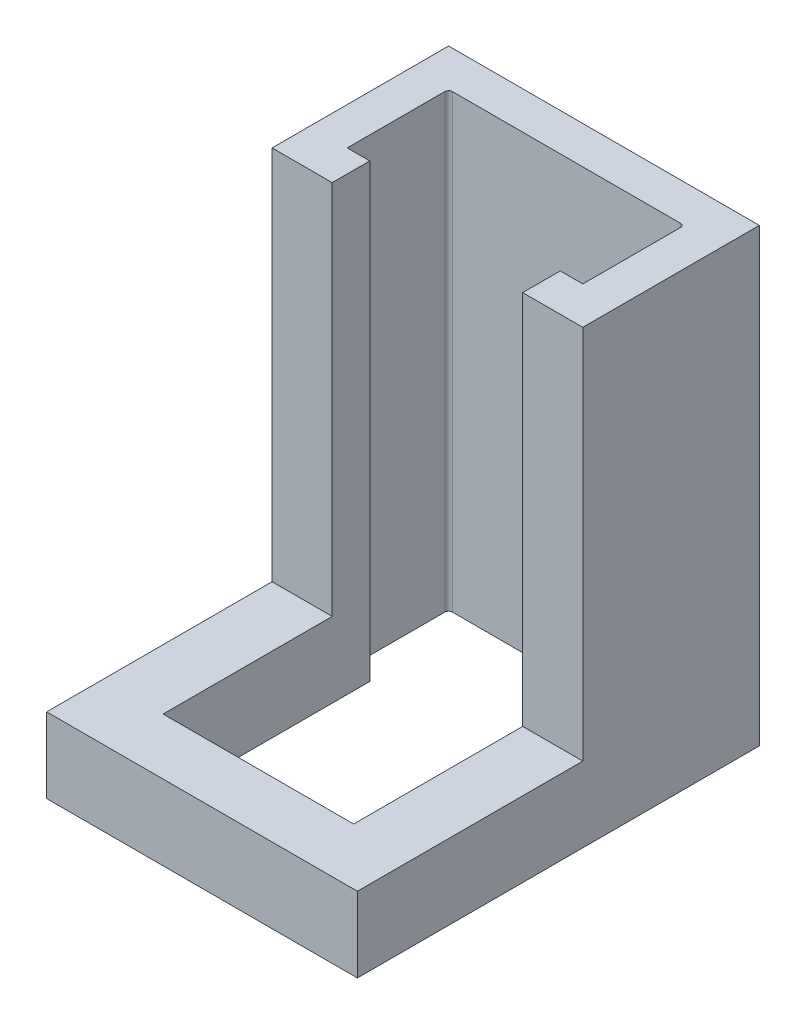
ISO-10303-21;
HEADER;
FILE_DESCRIPTION(('STEP AP214'),'2;1');
FILE_NAME('part.step','',(''),(''),'','','');
FILE_SCHEMA(('AUTOMOTIVE_DESIGN { 1 0 10303 214 1 1 1 1 }'));
ENDSEC;
DATA;
#1=APPLICATION_CONTEXT('core data for automotive mechanical design processes');
#2=APPLICATION_PROTOCOL_DEFINITION('international standard','automotive_design',2000,#1);
#3=PRODUCT_CONTEXT('',#1,'mechanical');
#4=PRODUCT('Part','Part','',(#3));
#5=PRODUCT_RELATED_PRODUCT_CATEGORY('part','',(#4));
#6=PRODUCT_DEFINITION_FORMATION('','',#4);
#7=PRODUCT_DEFINITION_CONTEXT('part definition',#1,'design');
#8=PRODUCT_DEFINITION('design','',#6,#7);
#9=PRODUCT_DEFINITION_SHAPE('','',#8);
#10=(LENGTH_UNIT() NAMED_UNIT(*) SI_UNIT(.MILLI.,.METRE.));
#11=(NAMED_UNIT(*) PLANE_ANGLE_UNIT() SI_UNIT($,.RADIAN.));
#12=(NAMED_UNIT(*) SI_UNIT($,.STERADIAN.) SOLID_ANGLE_UNIT());
#13=UNCERTAINTY_MEASURE_WITH_UNIT(LENGTH_MEASURE(1.E-05),#10,'distance_accuracy_value','');
#14=(GEOMETRIC_REPRESENTATION_CONTEXT(3) GLOBAL_UNCERTAINTY_ASSIGNED_CONTEXT((#13)) GLOBAL_UNIT_ASSIGNED_CONTEXT((#10,
#11,#12)) REPRESENTATION_CONTEXT('',''));
#15=CARTESIAN_POINT('',(0.,0.,0.));
#16=DIRECTION('',(0.,0.,1.));
#17=DIRECTION('',(1.,0.,0.));
#18=AXIS2_PLACEMENT_3D('',#15,#16,#17);
#19=CARTESIAN_POINT('',(15.6765625,50.,0.));
#20=DIRECTION('',(0.,0.,1.));
#21=DIRECTION('',(1.,0.,0.));
#22=AXIS2_PLACEMENT_3D('',#19,#20,#21);
#23=PLANE('',#22);
#24=DIRECTION('',(0.,-1.,0.));
#25=VECTOR('',#24,1.);
#26=CARTESIAN_POINT('',(15.6765625,50.,0.));
#27=LINE('',#26,#25);
#28=CARTESIAN_POINT('',(15.6765625,50.,0.));
#29=VERTEX_POINT('',#28);
#30=CARTESIAN_POINT('',(15.6765625,-10.,0.));
#31=VERTEX_POINT('',#30);
#32=EDGE_CURVE('E313',#29,#31,#27,.T.);
#33=ORIENTED_EDGE('',*,*,#32,.T.);
#34=DIRECTION('',(-1.,0.,0.));
#35=VECTOR('',#34,1.);
#36=CARTESIAN_POINT('',(15.6765625,-10.,0.));
#37=LINE('',#36,#35);
#38=CARTESIAN_POINT('',(12.6765625,-10.,0.));
#39=VERTEX_POINT('',#38);
#40=EDGE_CURVE('E211',#31,#39,#37,.T.);
#41=ORIENTED_EDGE('',*,*,#40,.T.);
#42=DIRECTION('',(0.,-1.,0.));
#43=VECTOR('',#42,1.);
#44=CARTESIAN_POINT('',(12.6765625,50.,0.));
#45=LINE('',#44,#43);
#46=CARTESIAN_POINT('',(12.6765625,50.,0.));
#47=VERTEX_POINT('',#46);
#48=EDGE_CURVE('E11',#47,#39,#45,.T.);
#49=ORIENTED_EDGE('',*,*,#48,.F.);
#50=DIRECTION('',(-1.,0.,0.));
#51=VECTOR('',#50,1.);
#52=CARTESIAN_POINT('',(15.6765625,50.,0.));
#53=LINE('',#52,#51);
#54=EDGE_CURVE('E272',#29,#47,#53,.T.);
#55=ORIENTED_EDGE('',*,*,#54,.F.);
#56=EDGE_LOOP('',(#33,#41,#49,#55));
#57=FACE_BOUND('',#56,.T.);
#58=ADVANCED_FACE('F38',(#57),#23,.F.);
#59=CARTESIAN_POINT('',(12.6765625,50.,0.));
#60=DIRECTION('',(1.,0.,0.));
#61=DIRECTION('',(0.,0.,-1.));
#62=AXIS2_PLACEMENT_3D('',#59,#60,#61);
#63=PLANE('',#62);
#64=ORIENTED_EDGE('',*,*,#48,.T.);
#65=DIRECTION('',(0.,0.,1.));
#66=VECTOR('',#65,1.);
#67=CARTESIAN_POINT('',(12.6765625,-10.,0.));
#68=LINE('',#67,#66);
#69=CARTESIAN_POINT('',(12.6765625,-10.,27.5));
#70=VERTEX_POINT('',#69);
#71=EDGE_CURVE('E215',#39,#70,#68,.T.);
#72=ORIENTED_EDGE('',*,*,#71,.T.);
#73=DIRECTION('',(0.,1.,0.));
#74=VECTOR('',#73,1.);
#75=CARTESIAN_POINT('',(12.6765625,-10.,27.5));
#76=LINE('',#75,#74);
#77=CARTESIAN_POINT('',(12.6765625,0.,27.5));
#78=VERTEX_POINT('',#77);
#79=EDGE_CURVE('E234',#70,#78,#76,.T.);
#80=ORIENTED_EDGE('',*,*,#79,.T.);
#81=DIRECTION('',(0.,0.,1.));
#82=VECTOR('',#81,1.);
#83=CARTESIAN_POINT('',(12.6765625,0.,27.5));
#84=LINE('',#83,#82);
#85=CARTESIAN_POINT('',(12.6765625,0.,5.00000000000001));
#86=VERTEX_POINT('',#85);
#87=EDGE_CURVE('E225',#86,#78,#84,.T.);
#88=ORIENTED_EDGE('',*,*,#87,.F.);
#89=DIRECTION('',(0.,-1.,0.));
#90=VECTOR('',#89,1.);
#91=CARTESIAN_POINT('',(12.6765625,50.,5.));
#92=LINE('',#91,#90);
#93=CARTESIAN_POINT('',(12.6765625,50.,5.));
#94=VERTEX_POINT('',#93);
#95=EDGE_CURVE('E47',#94,#86,#92,.T.);
#96=ORIENTED_EDGE('',*,*,#95,.F.);
#97=DIRECTION('',(0.,0.,1.));
#98=VECTOR('',#97,1.);
#99=CARTESIAN_POINT('',(12.6765625,50.,0.));
#100=LINE('',#99,#98);
#101=EDGE_CURVE('E275',#47,#94,#100,.T.);
#102=ORIENTED_EDGE('',*,*,#101,.F.);
#103=EDGE_LOOP('',(#64,#72,#80,#88,#96,#102));
#104=FACE_BOUND('',#103,.T.);
#105=ADVANCED_FACE('F360',(#104),#63,.F.);
#106=CARTESIAN_POINT('',(12.6765625,50.,5.));
#107=DIRECTION('',(0.,0.,-1.));
#108=DIRECTION('',(-1.,0.,0.));
#109=AXIS2_PLACEMENT_3D('',#106,#107,#108);
#110=PLANE('',#109);
#111=DIRECTION('',(1.,0.,0.));
#112=VECTOR('',#111,1.);
#113=CARTESIAN_POINT('',(12.6765625,0.,5.));
#114=LINE('',#113,#112);
#115=CARTESIAN_POINT('',(20.6765625,0.,5.));
#116=VERTEX_POINT('',#115);
#117=EDGE_CURVE('E271',#86,#116,#114,.T.);
#118=ORIENTED_EDGE('',*,*,#117,.T.);
#119=DIRECTION('',(0.,-1.,0.));
#120=VECTOR('',#119,1.);
#121=CARTESIAN_POINT('',(20.6765625,50.,5.));
#122=LINE('',#121,#120);
#123=CARTESIAN_POINT('',(20.6765625,50.,5.));
#124=VERTEX_POINT('',#123);
#125=EDGE_CURVE('E348',#124,#116,#122,.T.);
#126=ORIENTED_EDGE('',*,*,#125,.F.);
#127=DIRECTION('',(1.,0.,0.));
#128=VECTOR('',#127,1.);
#129=CARTESIAN_POINT('',(12.6765625,50.,5.));
#130=LINE('',#129,#128);
#131=EDGE_CURVE('E279',#94,#124,#130,.T.);
#132=ORIENTED_EDGE('',*,*,#131,.F.);
#133=ORIENTED_EDGE('',*,*,#95,.T.);
#134=EDGE_LOOP('',(#118,#126,#132,#133));
#135=FACE_BOUND('',#134,.T.);
#136=ADVANCED_FACE('F356',(#135),#110,.F.);
#137=CARTESIAN_POINT('',(20.6765625,50.,-18.49375));
#138=DIRECTION('',(-1.,0.,0.));
#139=DIRECTION('',(0.,0.,1.));
#140=AXIS2_PLACEMENT_3D('',#137,#138,#139);
#141=PLANE('',#140);
#142=ORIENTED_EDGE('',*,*,#125,.T.);
#143=DIRECTION('',(0.,0.,1.));
#144=VECTOR('',#143,1.);
#145=CARTESIAN_POINT('',(20.6765625,0.,5.));
#146=LINE('',#145,#144);
#147=CARTESIAN_POINT('',(20.6765625,0.,35.));
#148=VERTEX_POINT('',#147);
#149=EDGE_CURVE('E238',#116,#148,#146,.T.);
#150=ORIENTED_EDGE('',*,*,#149,.T.);
#151=DIRECTION('',(0.,1.,0.));
#152=VECTOR('',#151,1.);
#153=CARTESIAN_POINT('',(20.6765625,-10.,35.));
#154=LINE('',#153,#152);
#155=CARTESIAN_POINT('',(20.6765625,-10.,35.));
#156=VERTEX_POINT('',#155);
#157=EDGE_CURVE('E267',#156,#148,#154,.T.);
#158=ORIENTED_EDGE('',*,*,#157,.F.);
#159=DIRECTION('',(0.,0.,1.));
#160=VECTOR('',#159,1.);
#161=CARTESIAN_POINT('',(20.6765625,-10.,5.));
#162=LINE('',#161,#160);
#163=CARTESIAN_POINT('',(20.6765625,-10.,-18.49375));
#164=VERTEX_POINT('',#163);
#165=EDGE_CURVE('E243',#164,#156,#162,.T.);
#166=ORIENTED_EDGE('',*,*,#165,.F.);
#167=DIRECTION('',(0.,-1.,0.));
#168=VECTOR('',#167,1.);
#169=CARTESIAN_POINT('',(20.6765625,50.,-18.49375));
#170=LINE('',#169,#168);
#171=CARTESIAN_POINT('',(20.6765625,50.,-18.49375));
#172=VERTEX_POINT('',#171);
#173=EDGE_CURVE('E345',#172,#164,#170,.T.);
#174=ORIENTED_EDGE('',*,*,#173,.F.);
#175=DIRECTION('',(0.,0.,-1.));
#176=VECTOR('',#175,1.);
#177=CARTESIAN_POINT('',(20.6765625,50.,5.));
#178=LINE('',#177,#176);
#179=EDGE_CURVE('E282',#124,#172,#178,.T.);
#180=ORIENTED_EDGE('',*,*,#179,.F.);
#181=EDGE_LOOP('',(#142,#150,#158,#166,#174,#180));
#182=FACE_BOUND('',#181,.T.);
#183=ADVANCED_FACE('F368',(#182),#141,.F.);
#184=CARTESIAN_POINT('',(-20.6765625,50.,-18.49375));
#185=DIRECTION('',(0.,0.,1.));
#186=DIRECTION('',(1.,0.,0.));
#187=AXIS2_PLACEMENT_3D('',#184,#185,#186);
#188=PLANE('',#187);
#189=CARTESIAN_POINT('',(0.,10.,-18.49375));
#190=DIRECTION('',(0.,0.,-1.));
#191=DIRECTION('',(-1.,0.,0.));
#192=AXIS2_PLACEMENT_3D('',#189,#190,#191);
#193=CIRCLE('',#192,1.5);
#194=CARTESIAN_POINT('',(-1.5,10.,-18.49375));
#195=VERTEX_POINT('',#194);
#196=EDGE_CURVE('E659',#195,#195,#193,.T.);
#197=ORIENTED_EDGE('',*,*,#196,.F.);
#198=EDGE_LOOP('',(#197));
#199=FACE_BOUND('',#198,.T.);
#200=CARTESIAN_POINT('',(0.,20.,-18.49375));
#201=DIRECTION('',(0.,0.,-1.));
#202=DIRECTION('',(-1.,0.,0.));
#203=AXIS2_PLACEMENT_3D('',#200,#201,#202);
#204=CIRCLE('',#203,1.5);
#205=CARTESIAN_POINT('',(-1.49999999999997,20.,-18.49375));
#206=VERTEX_POINT('',#205);
#207=EDGE_CURVE('E668',#206,#206,#204,.T.);
#208=ORIENTED_EDGE('',*,*,#207,.F.);
#209=EDGE_LOOP('',(#208));
#210=FACE_BOUND('',#209,.T.);
#211=CARTESIAN_POINT('',(0.,30.,-18.49375));
#212=DIRECTION('',(0.,0.,-1.));
#213=DIRECTION('',(-1.,0.,0.));
#214=AXIS2_PLACEMENT_3D('',#211,#212,#213);
#215=CIRCLE('',#214,1.5);
#216=CARTESIAN_POINT('',(-1.49999999999993,30.,-18.49375));
#217=VERTEX_POINT('',#216);
#218=EDGE_CURVE('E676',#217,#217,#215,.T.);
#219=ORIENTED_EDGE('',*,*,#218,.F.);
#220=EDGE_LOOP('',(#219));
#221=FACE_BOUND('',#220,.T.);
#222=ORIENTED_EDGE('',*,*,#173,.T.);
#223=DIRECTION('',(1.,0.,0.));
#224=VECTOR('',#223,1.);
#225=CARTESIAN_POINT('',(20.6765625,-10.,-18.49375));
#226=LINE('',#225,#224);
#227=CARTESIAN_POINT('',(-20.6765625,-10.,-18.49375));
#228=VERTEX_POINT('',#227);
#229=EDGE_CURVE('E239',#228,#164,#226,.T.);
#230=ORIENTED_EDGE('',*,*,#229,.F.);
#231=DIRECTION('',(0.,-1.,0.));
#232=VECTOR('',#231,1.);
#233=CARTESIAN_POINT('',(-20.6765625,50.,-18.49375));
#234=LINE('',#233,#232);
#235=CARTESIAN_POINT('',(-20.6765625,50.,-18.49375));
#236=VERTEX_POINT('',#235);
#237=EDGE_CURVE('E342',#236,#228,#234,.T.);
#238=ORIENTED_EDGE('',*,*,#237,.F.);
#239=DIRECTION('',(-1.,0.,0.));
#240=VECTOR('',#239,1.);
#241=CARTESIAN_POINT('',(-20.6765625,50.,-18.49375));
#242=LINE('',#241,#240);
#243=EDGE_CURVE('E285',#172,#236,#242,.T.);
#244=ORIENTED_EDGE('',*,*,#243,.F.);
#245=EDGE_LOOP('',(#222,#230,#238,#244));
#246=FACE_BOUND('',#245,.T.);
#247=ADVANCED_FACE('F382',(#199,#210,#221,#246),#188,.F.);
#248=CARTESIAN_POINT('',(-20.6765625,50.,5.));
#249=DIRECTION('',(1.,0.,0.));
#250=DIRECTION('',(0.,0.,-1.));
#251=AXIS2_PLACEMENT_3D('',#248,#249,#250);
#252=PLANE('',#251);
#253=ORIENTED_EDGE('',*,*,#237,.T.);
#254=DIRECTION('',(0.,0.,-1.));
#255=VECTOR('',#254,1.);
#256=CARTESIAN_POINT('',(-20.6765625,-10.,35.));
#257=LINE('',#256,#255);
#258=CARTESIAN_POINT('',(-20.6765625,-10.,35.));
#259=VERTEX_POINT('',#258);
#260=EDGE_CURVE('E250',#259,#228,#257,.T.);
#261=ORIENTED_EDGE('',*,*,#260,.F.);
#262=DIRECTION('',(0.,1.,0.));
#263=VECTOR('',#262,1.);
#264=CARTESIAN_POINT('',(-20.6765625,-10.,35.));
#265=LINE('',#264,#263);
#266=CARTESIAN_POINT('',(-20.6765625,0.,35.));
#267=VERTEX_POINT('',#266);
#268=EDGE_CURVE('E254',#259,#267,#265,.T.);
#269=ORIENTED_EDGE('',*,*,#268,.T.);
#270=DIRECTION('',(0.,0.,-1.));
#271=VECTOR('',#270,1.);
#272=CARTESIAN_POINT('',(-20.6765625,0.,-18.49375));
#273=LINE('',#272,#271);
#274=CARTESIAN_POINT('',(-20.6765625,0.,5.));
#275=VERTEX_POINT('',#274);
#276=EDGE_CURVE('E244',#267,#275,#273,.T.);
#277=ORIENTED_EDGE('',*,*,#276,.T.);
#278=DIRECTION('',(0.,-1.,0.));
#279=VECTOR('',#278,1.);
#280=CARTESIAN_POINT('',(-20.6765625,50.,5.));
#281=LINE('',#280,#279);
#282=CARTESIAN_POINT('',(-20.6765625,50.,5.));
#283=VERTEX_POINT('',#282);
#284=EDGE_CURVE('E338',#283,#275,#281,.T.);
#285=ORIENTED_EDGE('',*,*,#284,.F.);
#286=DIRECTION('',(0.,0.,1.));
#287=VECTOR('',#286,1.);
#288=CARTESIAN_POINT('',(-20.6765625,50.,-18.49375));
#289=LINE('',#288,#287);
#290=EDGE_CURVE('E288',#236,#283,#289,.T.);
#291=ORIENTED_EDGE('',*,*,#290,.F.);
#292=EDGE_LOOP('',(#253,#261,#269,#277,#285,#291));
#293=FACE_BOUND('',#292,.T.);
#294=ADVANCED_FACE('F398',(#293),#252,.F.);
#295=CARTESIAN_POINT('',(-12.6765625,50.,5.));
#296=DIRECTION('',(0.,0.,-1.));
#297=DIRECTION('',(-1.,0.,0.));
#298=AXIS2_PLACEMENT_3D('',#295,#296,#297);
#299=PLANE('',#298);
#300=DIRECTION('',(1.,0.,0.));
#301=VECTOR('',#300,1.);
#302=CARTESIAN_POINT('',(-12.6765625,0.,5.));
#303=LINE('',#302,#301);
#304=CARTESIAN_POINT('',(-12.6765625,0.,5.));
#305=VERTEX_POINT('',#304);
#306=EDGE_CURVE('E276',#275,#305,#303,.T.);
#307=ORIENTED_EDGE('',*,*,#306,.T.);
#308=DIRECTION('',(0.,-1.,0.));
#309=VECTOR('',#308,1.);
#310=CARTESIAN_POINT('',(-12.6765625,50.,5.));
#311=LINE('',#310,#309);
#312=CARTESIAN_POINT('',(-12.6765625,50.,5.));
#313=VERTEX_POINT('',#312);
#314=EDGE_CURVE('E170',#313,#305,#311,.T.);
#315=ORIENTED_EDGE('',*,*,#314,.F.);
#316=DIRECTION('',(1.,0.,0.));
#317=VECTOR('',#316,1.);
#318=CARTESIAN_POINT('',(-12.6765625,50.,5.));
#319=LINE('',#318,#317);
#320=EDGE_CURVE('E291',#283,#313,#319,.T.);
#321=ORIENTED_EDGE('',*,*,#320,.F.);
#322=ORIENTED_EDGE('',*,*,#284,.T.);
#323=EDGE_LOOP('',(#307,#315,#321,#322));
#324=FACE_BOUND('',#323,.T.);
#325=ADVANCED_FACE('F395',(#324),#299,.F.);
#326=CARTESIAN_POINT('',(-12.6765625,50.,0.));
#327=DIRECTION('',(-1.,0.,0.));
#328=DIRECTION('',(0.,0.,1.));
#329=AXIS2_PLACEMENT_3D('',#326,#327,#328);
#330=PLANE('',#329);
#331=ORIENTED_EDGE('',*,*,#314,.T.);
#332=DIRECTION('',(0.,0.,-1.));
#333=VECTOR('',#332,1.);
#334=CARTESIAN_POINT('',(-12.6765625,0.,5.));
#335=LINE('',#334,#333);
#336=CARTESIAN_POINT('',(-12.6765625,0.,27.5));
#337=VERTEX_POINT('',#336);
#338=EDGE_CURVE('E222',#337,#305,#335,.T.);
#339=ORIENTED_EDGE('',*,*,#338,.F.);
#340=DIRECTION('',(0.,1.,0.));
#341=VECTOR('',#340,1.);
#342=CARTESIAN_POINT('',(-12.6765625,-10.,27.5));
#343=LINE('',#342,#341);
#344=CARTESIAN_POINT('',(-12.6765625,-10.,27.5));
#345=VERTEX_POINT('',#344);
#346=EDGE_CURVE('E179',#345,#337,#343,.T.);
#347=ORIENTED_EDGE('',*,*,#346,.F.);
#348=DIRECTION('',(0.,0.,-1.));
#349=VECTOR('',#348,1.);
#350=CARTESIAN_POINT('',(-12.6765625,-10.,5.));
#351=LINE('',#350,#349);
#352=CARTESIAN_POINT('',(-12.6765625,-10.,0.));
#353=VERTEX_POINT('',#352);
#354=EDGE_CURVE('E175',#345,#353,#351,.T.);
#355=ORIENTED_EDGE('',*,*,#354,.T.);
#356=DIRECTION('',(0.,-1.,0.));
#357=VECTOR('',#356,1.);
#358=CARTESIAN_POINT('',(-12.6765625,50.,0.));
#359=LINE('',#358,#357);
#360=CARTESIAN_POINT('',(-12.6765625,50.,0.));
#361=VERTEX_POINT('',#360);
#362=EDGE_CURVE('E159',#361,#353,#359,.T.);
#363=ORIENTED_EDGE('',*,*,#362,.F.);
#364=DIRECTION('',(0.,0.,-1.));
#365=VECTOR('',#364,1.);
#366=CARTESIAN_POINT('',(-12.6765625,50.,0.));
#367=LINE('',#366,#365);
#368=EDGE_CURVE('E294',#313,#361,#367,.T.);
#369=ORIENTED_EDGE('',*,*,#368,.F.);
#370=EDGE_LOOP('',(#331,#339,#347,#355,#363,#369));
#371=FACE_BOUND('',#370,.T.);
#372=ADVANCED_FACE('F177',(#371),#330,.F.);
#373=CARTESIAN_POINT('',(-15.6765625,50.,0.));
#374=DIRECTION('',(0.,0.,1.));
#375=DIRECTION('',(1.,0.,0.));
#376=AXIS2_PLACEMENT_3D('',#373,#374,#375);
#377=PLANE('',#376);
#378=ORIENTED_EDGE('',*,*,#362,.T.);
#379=DIRECTION('',(-1.,0.,0.));
#380=VECTOR('',#379,1.);
#381=CARTESIAN_POINT('',(-12.6765625,-10.,0.));
#382=LINE('',#381,#380);
#383=CARTESIAN_POINT('',(-15.6765625,-10.,0.));
#384=VERTEX_POINT('',#383);
#385=EDGE_CURVE('E164',#353,#384,#382,.T.);
#386=ORIENTED_EDGE('',*,*,#385,.T.);
#387=DIRECTION('',(0.,-1.,0.));
#388=VECTOR('',#387,1.);
#389=CARTESIAN_POINT('',(-15.6765625,50.,0.));
#390=LINE('',#389,#388);
#391=CARTESIAN_POINT('',(-15.6765625,50.,0.));
#392=VERTEX_POINT('',#391);
#393=EDGE_CURVE('E171',#392,#384,#390,.T.);
#394=ORIENTED_EDGE('',*,*,#393,.F.);
#395=DIRECTION('',(-1.,0.,0.));
#396=VECTOR('',#395,1.);
#397=CARTESIAN_POINT('',(-15.6765625,50.,0.));
#398=LINE('',#397,#396);
#399=EDGE_CURVE('E166',#361,#392,#398,.T.);
#400=ORIENTED_EDGE('',*,*,#399,.F.);
#401=EDGE_LOOP('',(#378,#386,#394,#400));
#402=FACE_BOUND('',#401,.T.);
#403=ADVANCED_FACE('F161',(#402),#377,.F.);
#404=CARTESIAN_POINT('',(-15.6765625,50.,0.));
#405=DIRECTION('',(-1.,0.,0.));
#406=DIRECTION('',(0.,0.,1.));
#407=AXIS2_PLACEMENT_3D('',#404,#405,#406);
#408=PLANE('',#407);
#409=ORIENTED_EDGE('',*,*,#393,.T.);
#410=DIRECTION('',(0.,0.,-1.));
#411=VECTOR('',#410,1.);
#412=CARTESIAN_POINT('',(-15.6765625,-10.,0.));
#413=LINE('',#412,#411);
#414=CARTESIAN_POINT('',(-15.6765625,-10.,-12.99375));
#415=VERTEX_POINT('',#414);
#416=EDGE_CURVE('E188',#384,#415,#413,.T.);
#417=ORIENTED_EDGE('',*,*,#416,.T.);
#418=DIRECTION('',(0.,-1.,0.));
#419=VECTOR('',#418,1.);
#420=CARTESIAN_POINT('',(-15.6765625,50.,-12.99375));
#421=LINE('',#420,#419);
#422=CARTESIAN_POINT('',(-15.6765625,50.,-12.99375));
#423=VERTEX_POINT('',#422);
#424=EDGE_CURVE('E331',#423,#415,#421,.T.);
#425=ORIENTED_EDGE('',*,*,#424,.F.);
#426=DIRECTION('',(0.,0.,-1.));
#427=VECTOR('',#426,1.);
#428=CARTESIAN_POINT('',(-15.6765625,50.,0.));
#429=LINE('',#428,#427);
#430=EDGE_CURVE('E299',#392,#423,#429,.T.);
#431=ORIENTED_EDGE('',*,*,#430,.F.);
#432=EDGE_LOOP('',(#409,#417,#425,#431));
#433=FACE_BOUND('',#432,.T.);
#434=ADVANCED_FACE('F498',(#433),#408,.F.);
#435=CARTESIAN_POINT('',(-15.1765625,50.,-12.99375));
#436=DIRECTION('',(0.,-1.,0.));
#437=DIRECTION('',(0.,0.,-1.));
#438=AXIS2_PLACEMENT_3D('',#435,#436,#437);
#439=CYLINDRICAL_SURFACE('',#438,0.5);
#440=ORIENTED_EDGE('',*,*,#424,.T.);
#441=CARTESIAN_POINT('',(-15.1765625,-10.,-12.99375));
#442=DIRECTION('',(0.,-1.,0.));
#443=DIRECTION('',(0.,0.,-1.));
#444=AXIS2_PLACEMENT_3D('',#441,#442,#443);
#445=CIRCLE('',#444,0.5);
#446=CARTESIAN_POINT('',(-15.1765625,-10.,-13.49375));
#447=VERTEX_POINT('',#446);
#448=EDGE_CURVE('E192',#415,#447,#445,.T.);
#449=ORIENTED_EDGE('',*,*,#448,.T.);
#450=DIRECTION('',(0.,-1.,0.));
#451=VECTOR('',#450,1.);
#452=CARTESIAN_POINT('',(-15.1765625,50.,-13.49375));
#453=LINE('',#452,#451);
#454=CARTESIAN_POINT('',(-15.1765625,50.,-13.49375));
#455=VERTEX_POINT('',#454);
#456=EDGE_CURVE('E328',#455,#447,#453,.T.);
#457=ORIENTED_EDGE('',*,*,#456,.F.);
#458=CARTESIAN_POINT('',(-15.1765625,50.,-12.99375));
#459=DIRECTION('',(0.,-1.,0.));
#460=DIRECTION('',(0.,0.,-1.));
#461=AXIS2_PLACEMENT_3D('',#458,#459,#460);
#462=CIRCLE('',#461,0.5);
#463=EDGE_CURVE('E302',#423,#455,#462,.T.);
#464=ORIENTED_EDGE('',*,*,#463,.F.);
#465=EDGE_LOOP('',(#440,#449,#457,#464));
#466=FACE_BOUND('',#465,.T.);
#467=ADVANCED_FACE('F443',(#466),#439,.F.);
#468=CARTESIAN_POINT('',(15.1765625,50.,-13.49375));
#469=DIRECTION('',(0.,0.,-1.));
#470=DIRECTION('',(-1.,0.,0.));
#471=AXIS2_PLACEMENT_3D('',#468,#469,#470);
#472=PLANE('',#471);
#473=CARTESIAN_POINT('',(0.,10.,-13.49375));
#474=DIRECTION('',(0.,0.,-1.));
#475=DIRECTION('',(-1.,0.,0.));
#476=AXIS2_PLACEMENT_3D('',#473,#474,#475);
#477=CIRCLE('',#476,1.5);
#478=CARTESIAN_POINT('',(-1.5,10.,-13.49375));
#479=VERTEX_POINT('',#478);
#480=EDGE_CURVE('E226',#479,#479,#477,.F.);
#481=ORIENTED_EDGE('',*,*,#480,.F.);
#482=EDGE_LOOP('',(#481));
#483=FACE_BOUND('',#482,.T.);
#484=CARTESIAN_POINT('',(0.,20.,-13.49375));
#485=DIRECTION('',(0.,0.,-1.));
#486=DIRECTION('',(-1.,0.,0.));
#487=AXIS2_PLACEMENT_3D('',#484,#485,#486);
#488=CIRCLE('',#487,1.5);
#489=CARTESIAN_POINT('',(-1.49999999999997,20.,-13.49375));
#490=VERTEX_POINT('',#489);
#491=EDGE_CURVE('E665',#490,#490,#488,.F.);
#492=ORIENTED_EDGE('',*,*,#491,.F.);
#493=EDGE_LOOP('',(#492));
#494=FACE_BOUND('',#493,.T.);
#495=CARTESIAN_POINT('',(0.,30.,-13.49375));
#496=DIRECTION('',(0.,0.,-1.));
#497=DIRECTION('',(-1.,0.,0.));
#498=AXIS2_PLACEMENT_3D('',#495,#496,#497);
#499=CIRCLE('',#498,1.5);
#500=CARTESIAN_POINT('',(-1.49999999999993,30.,-13.49375));
#501=VERTEX_POINT('',#500);
#502=EDGE_CURVE('E672',#501,#501,#499,.F.);
#503=ORIENTED_EDGE('',*,*,#502,.F.);
#504=EDGE_LOOP('',(#503));
#505=FACE_BOUND('',#504,.T.);
#506=ORIENTED_EDGE('',*,*,#456,.T.);
#507=DIRECTION('',(1.,0.,0.));
#508=VECTOR('',#507,1.);
#509=CARTESIAN_POINT('',(-15.1765625,-10.,-13.49375));
#510=LINE('',#509,#508);
#511=CARTESIAN_POINT('',(15.1765625,-10.,-13.49375));
#512=VERTEX_POINT('',#511);
#513=EDGE_CURVE('E199',#447,#512,#510,.T.);
#514=ORIENTED_EDGE('',*,*,#513,.T.);
#515=DIRECTION('',(0.,-1.,0.));
#516=VECTOR('',#515,1.);
#517=CARTESIAN_POINT('',(15.1765625,50.,-13.49375));
#518=LINE('',#517,#516);
#519=CARTESIAN_POINT('',(15.1765625,50.,-13.49375));
#520=VERTEX_POINT('',#519);
#521=EDGE_CURVE('E325',#520,#512,#518,.T.);
#522=ORIENTED_EDGE('',*,*,#521,.F.);
#523=DIRECTION('',(1.,0.,0.));
#524=VECTOR('',#523,1.);
#525=CARTESIAN_POINT('',(15.1765625,50.,-13.49375));
#526=LINE('',#525,#524);
#527=EDGE_CURVE('E305',#455,#520,#526,.T.);
#528=ORIENTED_EDGE('',*,*,#527,.F.);
#529=EDGE_LOOP('',(#506,#514,#522,#528));
#530=FACE_BOUND('',#529,.T.);
#531=ADVANCED_FACE('F438',(#483,#494,#505,#530),#472,.F.);
#532=CARTESIAN_POINT('',(15.1765625,50.,-12.99375));
#533=DIRECTION('',(0.,-1.,0.));
#534=DIRECTION('',(0.,0.,-1.));
#535=AXIS2_PLACEMENT_3D('',#532,#533,#534);
#536=CYLINDRICAL_SURFACE('',#535,0.5);
#537=ORIENTED_EDGE('',*,*,#521,.T.);
#538=CARTESIAN_POINT('',(15.1765625,-10.,-12.99375));
#539=DIRECTION('',(0.,-1.,0.));
#540=DIRECTION('',(0.,0.,-1.));
#541=AXIS2_PLACEMENT_3D('',#538,#539,#540);
#542=CIRCLE('',#541,0.5);
#543=CARTESIAN_POINT('',(15.6765625,-10.,-12.99375));
#544=VERTEX_POINT('',#543);
#545=EDGE_CURVE('E203',#512,#544,#542,.T.);
#546=ORIENTED_EDGE('',*,*,#545,.T.);
#547=DIRECTION('',(0.,-1.,0.));
#548=VECTOR('',#547,1.);
#549=CARTESIAN_POINT('',(15.6765625,50.,-12.99375));
#550=LINE('',#549,#548);
#551=CARTESIAN_POINT('',(15.6765625,50.,-12.99375));
#552=VERTEX_POINT('',#551);
#553=EDGE_CURVE('E322',#552,#544,#550,.T.);
#554=ORIENTED_EDGE('',*,*,#553,.F.);
#555=CARTESIAN_POINT('',(15.1765625,50.,-12.99375));
#556=DIRECTION('',(0.,-1.,0.));
#557=DIRECTION('',(0.,0.,1.));
#558=AXIS2_PLACEMENT_3D('',#555,#556,#557);
#559=CIRCLE('',#558,0.5);
#560=EDGE_CURVE('E308',#520,#552,#559,.T.);
#561=ORIENTED_EDGE('',*,*,#560,.F.);
#562=EDGE_LOOP('',(#537,#546,#554,#561));
#563=FACE_BOUND('',#562,.T.);
#564=ADVANCED_FACE('F442',(#563),#536,.F.);
#565=CARTESIAN_POINT('',(15.6765625,50.,0.));
#566=DIRECTION('',(1.,0.,0.));
#567=DIRECTION('',(0.,0.,-1.));
#568=AXIS2_PLACEMENT_3D('',#565,#566,#567);
#569=PLANE('',#568);
#570=ORIENTED_EDGE('',*,*,#553,.T.);
#571=DIRECTION('',(0.,0.,1.));
#572=VECTOR('',#571,1.);
#573=CARTESIAN_POINT('',(15.6765625,-10.,-12.99375));
#574=LINE('',#573,#572);
#575=EDGE_CURVE('E207',#544,#31,#574,.T.);
#576=ORIENTED_EDGE('',*,*,#575,.T.);
#577=ORIENTED_EDGE('',*,*,#32,.F.);
#578=DIRECTION('',(0.,0.,1.));
#579=VECTOR('',#578,1.);
#580=CARTESIAN_POINT('',(15.6765625,50.,0.));
#581=LINE('',#580,#579);
#582=EDGE_CURVE('E54',#552,#29,#581,.T.);
#583=ORIENTED_EDGE('',*,*,#582,.F.);
#584=EDGE_LOOP('',(#570,#576,#577,#583));
#585=FACE_BOUND('',#584,.T.);
#586=ADVANCED_FACE('F491',(#585),#569,.F.);
#587=CARTESIAN_POINT('',(-15.1765625,50.,-12.99375));
#588=DIRECTION('',(0.,-1.,0.));
#589=DIRECTION('',(0.,0.,-1.));
#590=AXIS2_PLACEMENT_3D('',#587,#588,#589);
#591=PLANE('',#590);
#592=ORIENTED_EDGE('',*,*,#54,.T.);
#593=ORIENTED_EDGE('',*,*,#101,.T.);
#594=ORIENTED_EDGE('',*,*,#131,.T.);
#595=ORIENTED_EDGE('',*,*,#179,.T.);
#596=ORIENTED_EDGE('',*,*,#243,.T.);
#597=ORIENTED_EDGE('',*,*,#290,.T.);
#598=ORIENTED_EDGE('',*,*,#320,.T.);
#599=ORIENTED_EDGE('',*,*,#368,.T.);
#600=ORIENTED_EDGE('',*,*,#399,.T.);
#601=ORIENTED_EDGE('',*,*,#430,.T.);
#602=ORIENTED_EDGE('',*,*,#463,.T.);
#603=ORIENTED_EDGE('',*,*,#527,.T.);
#604=ORIENTED_EDGE('',*,*,#560,.T.);
#605=ORIENTED_EDGE('',*,*,#582,.T.);
#606=EDGE_LOOP('',(#592,#593,#594,#595,#596,#597,#598,#599,#600,#601,#602,#603,#604,#605));
#607=FACE_BOUND('',#606,.T.);
#608=ADVANCED_FACE('F384',(#607),#591,.F.);
#609=CARTESIAN_POINT('',(0.,0.,0.));
#610=DIRECTION('',(0.,1.,0.));
#611=DIRECTION('',(0.,0.,1.));
#612=AXIS2_PLACEMENT_3D('',#609,#610,#611);
#613=PLANE('',#612);
#614=ORIENTED_EDGE('',*,*,#306,.F.);
#615=ORIENTED_EDGE('',*,*,#276,.F.);
#616=DIRECTION('',(-1.,0.,0.));
#617=VECTOR('',#616,1.);
#618=CARTESIAN_POINT('',(20.6765625,0.,35.));
#619=LINE('',#618,#617);
#620=EDGE_CURVE('E257',#148,#267,#619,.T.);
#621=ORIENTED_EDGE('',*,*,#620,.F.);
#622=ORIENTED_EDGE('',*,*,#149,.F.);
#623=ORIENTED_EDGE('',*,*,#117,.F.);
#624=ORIENTED_EDGE('',*,*,#87,.T.);
#625=DIRECTION('',(-1.,0.,0.));
#626=VECTOR('',#625,1.);
#627=CARTESIAN_POINT('',(-12.6765625,0.,27.5));
#628=LINE('',#627,#626);
#629=EDGE_CURVE('E183',#78,#337,#628,.T.);
#630=ORIENTED_EDGE('',*,*,#629,.T.);
#631=ORIENTED_EDGE('',*,*,#338,.T.);
#632=EDGE_LOOP('',(#614,#615,#621,#622,#623,#624,#630,#631));
#633=FACE_BOUND('',#632,.T.);
#634=ADVANCED_FACE('F363',(#633),#613,.T.);
#635=CARTESIAN_POINT('',(0.,-10.,0.));
#636=DIRECTION('',(0.,1.,0.));
#637=DIRECTION('',(0.,0.,1.));
#638=AXIS2_PLACEMENT_3D('',#635,#636,#637);
#639=PLANE('',#638);
#640=ORIENTED_EDGE('',*,*,#229,.T.);
#641=ORIENTED_EDGE('',*,*,#165,.T.);
#642=DIRECTION('',(-1.,0.,0.));
#643=VECTOR('',#642,1.);
#644=CARTESIAN_POINT('',(20.6765625,-10.,35.));
#645=LINE('',#644,#643);
#646=EDGE_CURVE('E247',#156,#259,#645,.T.);
#647=ORIENTED_EDGE('',*,*,#646,.T.);
#648=ORIENTED_EDGE('',*,*,#260,.T.);
#649=EDGE_LOOP('',(#640,#641,#647,#648));
#650=FACE_BOUND('',#649,.T.);
#651=ORIENTED_EDGE('',*,*,#354,.F.);
#652=DIRECTION('',(-1.,0.,0.));
#653=VECTOR('',#652,1.);
#654=CARTESIAN_POINT('',(-12.6765625,-10.,27.5));
#655=LINE('',#654,#653);
#656=EDGE_CURVE('E219',#70,#345,#655,.T.);
#657=ORIENTED_EDGE('',*,*,#656,.F.);
#658=ORIENTED_EDGE('',*,*,#71,.F.);
#659=ORIENTED_EDGE('',*,*,#40,.F.);
#660=ORIENTED_EDGE('',*,*,#575,.F.);
#661=ORIENTED_EDGE('',*,*,#545,.F.);
#662=ORIENTED_EDGE('',*,*,#513,.F.);
#663=ORIENTED_EDGE('',*,*,#448,.F.);
#664=ORIENTED_EDGE('',*,*,#416,.F.);
#665=ORIENTED_EDGE('',*,*,#385,.F.);
#666=EDGE_LOOP('',(#651,#657,#658,#659,#660,#661,#662,#663,#664,#665));
#667=FACE_BOUND('',#666,.T.);
#668=ADVANCED_FACE('F185',(#650,#667),#639,.F.);
#669=CARTESIAN_POINT('',(20.6765625,-10.,35.));
#670=DIRECTION('',(0.,0.,-1.));
#671=DIRECTION('',(-1.,0.,0.));
#672=AXIS2_PLACEMENT_3D('',#669,#670,#671);
#673=PLANE('',#672);
#674=ORIENTED_EDGE('',*,*,#620,.T.);
#675=ORIENTED_EDGE('',*,*,#268,.F.);
#676=ORIENTED_EDGE('',*,*,#646,.F.);
#677=ORIENTED_EDGE('',*,*,#157,.T.);
#678=EDGE_LOOP('',(#674,#675,#676,#677));
#679=FACE_BOUND('',#678,.T.);
#680=ADVANCED_FACE('F373',(#679),#673,.F.);
#681=CARTESIAN_POINT('',(-12.6765625,-10.,27.5));
#682=DIRECTION('',(0.,0.,-1.));
#683=DIRECTION('',(-1.,0.,0.));
#684=AXIS2_PLACEMENT_3D('',#681,#682,#683);
#685=PLANE('',#684);
#686=ORIENTED_EDGE('',*,*,#629,.F.);
#687=ORIENTED_EDGE('',*,*,#79,.F.);
#688=ORIENTED_EDGE('',*,*,#656,.T.);
#689=ORIENTED_EDGE('',*,*,#346,.T.);
#690=EDGE_LOOP('',(#686,#687,#688,#689));
#691=FACE_BOUND('',#690,.T.);
#692=ADVANCED_FACE('F392',(#691),#685,.T.);
#693=CARTESIAN_POINT('',(0.,30.,35.001));
#694=DIRECTION('',(0.,0.,-1.));
#695=DIRECTION('',(-1.,0.,0.));
#696=AXIS2_PLACEMENT_3D('',#693,#694,#695);
#697=CYLINDRICAL_SURFACE('',#696,1.5);
#698=CARTESIAN_POINT('',(-1.49999999999993,30.,-18.49375));
#699=CARTESIAN_POINT('',(-1.49999999999993,30.,-18.4416666666667));
#700=CARTESIAN_POINT('',(-1.49999999999993,30.,-18.3895833333333));
#701=CARTESIAN_POINT('',(-1.49999999999993,30.,-18.2854166666667));
#702=CARTESIAN_POINT('',(-1.49999999999993,30.,-18.2333333333333));
#703=CARTESIAN_POINT('',(-1.49999999999993,30.,-18.1291666666667));
#704=CARTESIAN_POINT('',(-1.49999999999993,30.,-18.0770833333333));
#705=CARTESIAN_POINT('',(-1.49999999999993,30.,-17.9729166666667));
#706=CARTESIAN_POINT('',(-1.49999999999993,30.,-17.9208333333333));
#707=CARTESIAN_POINT('',(-1.49999999999993,30.,-17.8166666666667));
#708=CARTESIAN_POINT('',(-1.49999999999993,30.,-17.7645833333333));
#709=CARTESIAN_POINT('',(-1.49999999999993,30.,-17.6604166666667));
#710=CARTESIAN_POINT('',(-1.49999999999993,30.,-17.6083333333333));
#711=CARTESIAN_POINT('',(-1.49999999999993,30.,-17.5041666666667));
#712=CARTESIAN_POINT('',(-1.49999999999993,30.,-17.4520833333333));
#713=CARTESIAN_POINT('',(-1.49999999999993,30.,-17.3479166666667));
#714=CARTESIAN_POINT('',(-1.49999999999993,30.,-17.2958333333333));
#715=CARTESIAN_POINT('',(-1.49999999999993,30.,-17.1916666666667));
#716=CARTESIAN_POINT('',(-1.49999999999993,30.,-17.1395833333333));
#717=CARTESIAN_POINT('',(-1.49999999999993,30.,-17.0354166666667));
#718=CARTESIAN_POINT('',(-1.49999999999993,30.,-16.9833333333333));
#719=CARTESIAN_POINT('',(-1.49999999999993,30.,-16.8791666666667));
#720=CARTESIAN_POINT('',(-1.49999999999993,30.,-16.8270833333333));
#721=CARTESIAN_POINT('',(-1.49999999999993,30.,-16.7229166666667));
#722=CARTESIAN_POINT('',(-1.49999999999993,30.,-16.6708333333333));
#723=CARTESIAN_POINT('',(-1.49999999999993,30.,-16.5666666666667));
#724=CARTESIAN_POINT('',(-1.49999999999993,30.,-16.5145833333333));
#725=CARTESIAN_POINT('',(-1.49999999999993,30.,-16.4104166666667));
#726=CARTESIAN_POINT('',(-1.49999999999993,30.,-16.3583333333333));
#727=CARTESIAN_POINT('',(-1.49999999999993,30.,-16.2541666666667));
#728=CARTESIAN_POINT('',(-1.49999999999993,30.,-16.2020833333333));
#729=CARTESIAN_POINT('',(-1.49999999999993,30.,-16.0979166666667));
#730=CARTESIAN_POINT('',(-1.49999999999993,30.,-16.0458333333333));
#731=CARTESIAN_POINT('',(-1.49999999999993,30.,-15.9416666666667));
#732=CARTESIAN_POINT('',(-1.49999999999993,30.,-15.8895833333333));
#733=CARTESIAN_POINT('',(-1.49999999999993,30.,-15.7854166666667));
#734=CARTESIAN_POINT('',(-1.49999999999993,30.,-15.7333333333333));
#735=CARTESIAN_POINT('',(-1.49999999999993,30.,-15.6291666666667));
#736=CARTESIAN_POINT('',(-1.49999999999993,30.,-15.5770833333333));
#737=CARTESIAN_POINT('',(-1.49999999999993,30.,-15.4729166666667));
#738=CARTESIAN_POINT('',(-1.49999999999993,30.,-15.4208333333333));
#739=CARTESIAN_POINT('',(-1.49999999999993,30.,-15.3166666666667));
#740=CARTESIAN_POINT('',(-1.49999999999993,30.,-15.2645833333333));
#741=CARTESIAN_POINT('',(-1.49999999999993,30.,-15.1604166666667));
#742=CARTESIAN_POINT('',(-1.49999999999993,30.,-15.1083333333333));
#743=CARTESIAN_POINT('',(-1.49999999999993,30.,-15.0041666666667));
#744=CARTESIAN_POINT('',(-1.49999999999993,30.,-14.9520833333333));
#745=CARTESIAN_POINT('',(-1.49999999999993,30.,-14.8479166666667));
#746=CARTESIAN_POINT('',(-1.49999999999993,30.,-14.7958333333333));
#747=CARTESIAN_POINT('',(-1.49999999999993,30.,-14.6916666666667));
#748=CARTESIAN_POINT('',(-1.49999999999993,30.,-14.6395833333333));
#749=CARTESIAN_POINT('',(-1.49999999999993,30.,-14.5354166666667));
#750=CARTESIAN_POINT('',(-1.49999999999993,30.,-14.4833333333333));
#751=CARTESIAN_POINT('',(-1.49999999999993,30.,-14.3791666666667));
#752=CARTESIAN_POINT('',(-1.49999999999993,30.,-14.3270833333333));
#753=CARTESIAN_POINT('',(-1.49999999999993,30.,-14.2229166666666));
#754=CARTESIAN_POINT('',(-1.49999999999993,30.,-14.1708333333333));
#755=CARTESIAN_POINT('',(-1.49999999999993,30.,-14.0666666666667));
#756=CARTESIAN_POINT('',(-1.49999999999993,30.,-14.0145833333333));
#757=CARTESIAN_POINT('',(-1.49999999999993,30.,-13.9104166666667));
#758=CARTESIAN_POINT('',(-1.49999999999993,30.,-13.8583333333333));
#759=CARTESIAN_POINT('',(-1.49999999999993,30.,-13.7541666666667));
#760=CARTESIAN_POINT('',(-1.49999999999993,30.,-13.7020833333333));
#761=CARTESIAN_POINT('',(-1.49999999999993,30.,-13.5979166666666));
#762=CARTESIAN_POINT('',(-1.49999999999993,30.,-13.5458333333333));
#763=CARTESIAN_POINT('',(-1.49999999999993,30.,-13.49375));
#764=B_SPLINE_CURVE_WITH_KNOTS('',3,(#698,#699,#700,#701,#702,#703,#704,#705,#706,#707,#708,
#709,#710,#711,#712,#713,#714,#715,#716,#717,#718,#719,#720,#721,#722,#723,#724,#725,#726,#727,
#728,#729,#730,#731,#732,#733,#734,#735,#736,#737,#738,#739,#740,#741,#742,#743,#744,#745,#746,
#747,#748,#749,#750,#751,#752,#753,#754,#755,#756,#757,#758,#759,#760,#761,#762,#763),
.UNSPECIFIED.,.F.,.F.,(4,2,2,2,2,2,2,2,2,2,2,2,2,2,2,2,2,2,2,2,2,2,2,2,2,2,2,2,2,2,2,2,4),(0.,
0.156249999999997,0.3125,0.468750000000004,0.625000000000001,0.781249999999997,
0.937500000000001,1.09375,1.25,1.40625,1.5625,1.71875,1.875,2.03125,2.1875,2.34375000000001,2.5,
2.65625,2.8125,2.96875000000001,3.125,3.28125,3.4375,3.59375000000001,3.75,3.90625,4.0625,
4.21875000000001,4.375,4.53125,4.6875,4.84375000000001,5.),.UNSPECIFIED.);
#765=EDGE_CURVE('BSEAM450',#217,#501,#764,.T.);
#766=ORIENTED_EDGE('',*,*,#218,.T.);
#767=ORIENTED_EDGE('',*,*,#502,.T.);
#768=ORIENTED_EDGE('',*,*,#765,.T.);
#769=ORIENTED_EDGE('',*,*,#765,.F.);
#770=EDGE_LOOP('',(#766,#768,#767,#769));
#771=FACE_BOUND('',#770,.T.);
#772=ADVANCED_FACE('F450',(#771),#697,.F.);
#773=CARTESIAN_POINT('',(0.,20.,35.001));
#774=DIRECTION('',(0.,0.,-1.));
#775=DIRECTION('',(-1.,0.,0.));
#776=AXIS2_PLACEMENT_3D('',#773,#774,#775);
#777=CYLINDRICAL_SURFACE('',#776,1.5);
#778=CARTESIAN_POINT('',(-1.49999999999997,20.,-18.49375));
#779=CARTESIAN_POINT('',(-1.49999999999997,20.,-18.4416666666667));
#780=CARTESIAN_POINT('',(-1.49999999999997,20.,-18.3895833333333));
#781=CARTESIAN_POINT('',(-1.49999999999997,20.,-18.2854166666667));
#782=CARTESIAN_POINT('',(-1.49999999999997,20.,-18.2333333333333));
#783=CARTESIAN_POINT('',(-1.49999999999997,20.,-18.1291666666667));
#784=CARTESIAN_POINT('',(-1.49999999999997,20.,-18.0770833333333));
#785=CARTESIAN_POINT('',(-1.49999999999997,20.,-17.9729166666667));
#786=CARTESIAN_POINT('',(-1.49999999999997,20.,-17.9208333333333));
#787=CARTESIAN_POINT('',(-1.49999999999997,20.,-17.8166666666667));
#788=CARTESIAN_POINT('',(-1.49999999999997,20.,-17.7645833333333));
#789=CARTESIAN_POINT('',(-1.49999999999997,20.,-17.6604166666667));
#790=CARTESIAN_POINT('',(-1.49999999999997,20.,-17.6083333333333));
#791=CARTESIAN_POINT('',(-1.49999999999997,20.,-17.5041666666667));
#792=CARTESIAN_POINT('',(-1.49999999999997,20.,-17.4520833333333));
#793=CARTESIAN_POINT('',(-1.49999999999997,20.,-17.3479166666667));
#794=CARTESIAN_POINT('',(-1.49999999999997,20.,-17.2958333333333));
#795=CARTESIAN_POINT('',(-1.49999999999997,20.,-17.1916666666667));
#796=CARTESIAN_POINT('',(-1.49999999999997,20.,-17.1395833333333));
#797=CARTESIAN_POINT('',(-1.49999999999997,20.,-17.0354166666667));
#798=CARTESIAN_POINT('',(-1.49999999999997,20.,-16.9833333333333));
#799=CARTESIAN_POINT('',(-1.49999999999997,20.,-16.8791666666667));
#800=CARTESIAN_POINT('',(-1.49999999999997,20.,-16.8270833333333));
#801=CARTESIAN_POINT('',(-1.49999999999997,20.,-16.7229166666667));
#802=CARTESIAN_POINT('',(-1.49999999999997,20.,-16.6708333333333));
#803=CARTESIAN_POINT('',(-1.49999999999997,20.,-16.5666666666667));
#804=CARTESIAN_POINT('',(-1.49999999999997,20.,-16.5145833333333));
#805=CARTESIAN_POINT('',(-1.49999999999997,20.,-16.4104166666667));
#806=CARTESIAN_POINT('',(-1.49999999999997,20.,-16.3583333333333));
#807=CARTESIAN_POINT('',(-1.49999999999997,20.,-16.2541666666667));
#808=CARTESIAN_POINT('',(-1.49999999999997,20.,-16.2020833333333));
#809=CARTESIAN_POINT('',(-1.49999999999997,20.,-16.0979166666667));
#810=CARTESIAN_POINT('',(-1.49999999999997,20.,-16.0458333333333));
#811=CARTESIAN_POINT('',(-1.49999999999997,20.,-15.9416666666667));
#812=CARTESIAN_POINT('',(-1.49999999999997,20.,-15.8895833333333));
#813=CARTESIAN_POINT('',(-1.49999999999997,20.,-15.7854166666667));
#814=CARTESIAN_POINT('',(-1.49999999999997,20.,-15.7333333333333));
#815=CARTESIAN_POINT('',(-1.49999999999997,20.,-15.6291666666667));
#816=CARTESIAN_POINT('',(-1.49999999999997,20.,-15.5770833333333));
#817=CARTESIAN_POINT('',(-1.49999999999997,20.,-15.4729166666667));
#818=CARTESIAN_POINT('',(-1.49999999999997,20.,-15.4208333333333));
#819=CARTESIAN_POINT('',(-1.49999999999997,20.,-15.3166666666667));
#820=CARTESIAN_POINT('',(-1.49999999999997,20.,-15.2645833333333));
#821=CARTESIAN_POINT('',(-1.49999999999997,20.,-15.1604166666667));
#822=CARTESIAN_POINT('',(-1.49999999999997,20.,-15.1083333333333));
#823=CARTESIAN_POINT('',(-1.49999999999997,20.,-15.0041666666667));
#824=CARTESIAN_POINT('',(-1.49999999999997,20.,-14.9520833333333));
#825=CARTESIAN_POINT('',(-1.49999999999997,20.,-14.8479166666667));
#826=CARTESIAN_POINT('',(-1.49999999999997,20.,-14.7958333333333));
#827=CARTESIAN_POINT('',(-1.49999999999997,20.,-14.6916666666667));
#828=CARTESIAN_POINT('',(-1.49999999999997,20.,-14.6395833333333));
#829=CARTESIAN_POINT('',(-1.49999999999997,20.,-14.5354166666667));
#830=CARTESIAN_POINT('',(-1.49999999999997,20.,-14.4833333333333));
#831=CARTESIAN_POINT('',(-1.49999999999997,20.,-14.3791666666667));
#832=CARTESIAN_POINT('',(-1.49999999999997,20.,-14.3270833333333));
#833=CARTESIAN_POINT('',(-1.49999999999997,20.,-14.2229166666666));
#834=CARTESIAN_POINT('',(-1.49999999999997,20.,-14.1708333333333));
#835=CARTESIAN_POINT('',(-1.49999999999997,20.,-14.0666666666667));
#836=CARTESIAN_POINT('',(-1.49999999999997,20.,-14.0145833333333));
#837=CARTESIAN_POINT('',(-1.49999999999997,20.,-13.9104166666667));
#838=CARTESIAN_POINT('',(-1.49999999999997,20.,-13.8583333333333));
#839=CARTESIAN_POINT('',(-1.49999999999997,20.,-13.7541666666667));
#840=CARTESIAN_POINT('',(-1.49999999999997,20.,-13.7020833333333));
#841=CARTESIAN_POINT('',(-1.49999999999997,20.,-13.5979166666666));
#842=CARTESIAN_POINT('',(-1.49999999999997,20.,-13.5458333333333));
#843=CARTESIAN_POINT('',(-1.49999999999997,20.,-13.49375));
#844=B_SPLINE_CURVE_WITH_KNOTS('',3,(#778,#779,#780,#781,#782,#783,#784,#785,#786,#787,#788,
#789,#790,#791,#792,#793,#794,#795,#796,#797,#798,#799,#800,#801,#802,#803,#804,#805,#806,#807,
#808,#809,#810,#811,#812,#813,#814,#815,#816,#817,#818,#819,#820,#821,#822,#823,#824,#825,#826,
#827,#828,#829,#830,#831,#832,#833,#834,#835,#836,#837,#838,#839,#840,#841,#842,#843),
.UNSPECIFIED.,.F.,.F.,(4,2,2,2,2,2,2,2,2,2,2,2,2,2,2,2,2,2,2,2,2,2,2,2,2,2,2,2,2,2,2,2,4),(0.,
0.156249999999997,0.3125,0.468750000000004,0.625000000000001,0.781249999999997,
0.937500000000001,1.09375,1.25,1.40625,1.5625,1.71875,1.875,2.03125,2.1875,2.34375000000001,2.5,
2.65625,2.8125,2.96875000000001,3.125,3.28125,3.4375,3.59375000000001,3.75,3.90625,4.0625,
4.21875000000001,4.375,4.53125,4.6875,4.84375000000001,5.),.UNSPECIFIED.);
#845=EDGE_CURVE('BSEAM455',#206,#490,#844,.T.);
#846=ORIENTED_EDGE('',*,*,#207,.T.);
#847=ORIENTED_EDGE('',*,*,#491,.T.);
#848=ORIENTED_EDGE('',*,*,#845,.T.);
#849=ORIENTED_EDGE('',*,*,#845,.F.);
#850=EDGE_LOOP('',(#846,#848,#847,#849));
#851=FACE_BOUND('',#850,.T.);
#852=ADVANCED_FACE('F455',(#851),#777,.F.);
#853=CARTESIAN_POINT('',(0.,10.,35.001));
#854=DIRECTION('',(0.,0.,-1.));
#855=DIRECTION('',(-1.,0.,0.));
#856=AXIS2_PLACEMENT_3D('',#853,#854,#855);
#857=CYLINDRICAL_SURFACE('',#856,1.5);
#858=CARTESIAN_POINT('',(-1.5,10.,-18.49375));
#859=CARTESIAN_POINT('',(-1.5,10.,-18.4416666666667));
#860=CARTESIAN_POINT('',(-1.5,10.,-18.3895833333333));
#861=CARTESIAN_POINT('',(-1.5,10.,-18.2854166666667));
#862=CARTESIAN_POINT('',(-1.5,10.,-18.2333333333333));
#863=CARTESIAN_POINT('',(-1.5,10.,-18.1291666666667));
#864=CARTESIAN_POINT('',(-1.5,10.,-18.0770833333333));
#865=CARTESIAN_POINT('',(-1.5,10.,-17.9729166666667));
#866=CARTESIAN_POINT('',(-1.5,10.,-17.9208333333333));
#867=CARTESIAN_POINT('',(-1.5,10.,-17.8166666666667));
#868=CARTESIAN_POINT('',(-1.5,10.,-17.7645833333333));
#869=CARTESIAN_POINT('',(-1.5,10.,-17.6604166666667));
#870=CARTESIAN_POINT('',(-1.5,10.,-17.6083333333333));
#871=CARTESIAN_POINT('',(-1.5,10.,-17.5041666666667));
#872=CARTESIAN_POINT('',(-1.5,10.,-17.4520833333333));
#873=CARTESIAN_POINT('',(-1.5,10.,-17.3479166666667));
#874=CARTESIAN_POINT('',(-1.5,10.,-17.2958333333333));
#875=CARTESIAN_POINT('',(-1.5,10.,-17.1916666666667));
#876=CARTESIAN_POINT('',(-1.5,10.,-17.1395833333333));
#877=CARTESIAN_POINT('',(-1.5,10.,-17.0354166666667));
#878=CARTESIAN_POINT('',(-1.5,10.,-16.9833333333333));
#879=CARTESIAN_POINT('',(-1.5,10.,-16.8791666666667));
#880=CARTESIAN_POINT('',(-1.5,10.,-16.8270833333333));
#881=CARTESIAN_POINT('',(-1.5,10.,-16.7229166666667));
#882=CARTESIAN_POINT('',(-1.5,10.,-16.6708333333333));
#883=CARTESIAN_POINT('',(-1.5,10.,-16.5666666666667));
#884=CARTESIAN_POINT('',(-1.5,10.,-16.5145833333333));
#885=CARTESIAN_POINT('',(-1.5,10.,-16.4104166666667));
#886=CARTESIAN_POINT('',(-1.5,10.,-16.3583333333333));
#887=CARTESIAN_POINT('',(-1.5,10.,-16.2541666666667));
#888=CARTESIAN_POINT('',(-1.5,10.,-16.2020833333333));
#889=CARTESIAN_POINT('',(-1.5,10.,-16.0979166666667));
#890=CARTESIAN_POINT('',(-1.5,10.,-16.0458333333333));
#891=CARTESIAN_POINT('',(-1.5,10.,-15.9416666666667));
#892=CARTESIAN_POINT('',(-1.5,10.,-15.8895833333333));
#893=CARTESIAN_POINT('',(-1.5,10.,-15.7854166666667));
#894=CARTESIAN_POINT('',(-1.5,10.,-15.7333333333333));
#895=CARTESIAN_POINT('',(-1.5,10.,-15.6291666666667));
#896=CARTESIAN_POINT('',(-1.5,10.,-15.5770833333333));
#897=CARTESIAN_POINT('',(-1.5,10.,-15.4729166666667));
#898=CARTESIAN_POINT('',(-1.5,10.,-15.4208333333333));
#899=CARTESIAN_POINT('',(-1.5,10.,-15.3166666666667));
#900=CARTESIAN_POINT('',(-1.5,10.,-15.2645833333333));
#901=CARTESIAN_POINT('',(-1.5,10.,-15.1604166666667));
#902=CARTESIAN_POINT('',(-1.5,10.,-15.1083333333333));
#903=CARTESIAN_POINT('',(-1.5,10.,-15.0041666666667));
#904=CARTESIAN_POINT('',(-1.5,10.,-14.9520833333333));
#905=CARTESIAN_POINT('',(-1.5,10.,-14.8479166666667));
#906=CARTESIAN_POINT('',(-1.5,10.,-14.7958333333333));
#907=CARTESIAN_POINT('',(-1.5,10.,-14.6916666666667));
#908=CARTESIAN_POINT('',(-1.5,10.,-14.6395833333333));
#909=CARTESIAN_POINT('',(-1.5,10.,-14.5354166666667));
#910=CARTESIAN_POINT('',(-1.5,10.,-14.4833333333333));
#911=CARTESIAN_POINT('',(-1.5,10.,-14.3791666666667));
#912=CARTESIAN_POINT('',(-1.5,10.,-14.3270833333333));
#913=CARTESIAN_POINT('',(-1.5,10.,-14.2229166666666));
#914=CARTESIAN_POINT('',(-1.5,10.,-14.1708333333333));
#915=CARTESIAN_POINT('',(-1.5,10.,-14.0666666666667));
#916=CARTESIAN_POINT('',(-1.5,10.,-14.0145833333333));
#917=CARTESIAN_POINT('',(-1.5,10.,-13.9104166666667));
#918=CARTESIAN_POINT('',(-1.5,10.,-13.8583333333333));
#919=CARTESIAN_POINT('',(-1.5,10.,-13.7541666666667));
#920=CARTESIAN_POINT('',(-1.5,10.,-13.7020833333333));
#921=CARTESIAN_POINT('',(-1.5,10.,-13.5979166666666));
#922=CARTESIAN_POINT('',(-1.5,10.,-13.5458333333333));
#923=CARTESIAN_POINT('',(-1.5,10.,-13.49375));
#924=B_SPLINE_CURVE_WITH_KNOTS('',3,(#858,#859,#860,#861,#862,#863,#864,#865,#866,#867,#868,
#869,#870,#871,#872,#873,#874,#875,#876,#877,#878,#879,#880,#881,#882,#883,#884,#885,#886,#887,
#888,#889,#890,#891,#892,#893,#894,#895,#896,#897,#898,#899,#900,#901,#902,#903,#904,#905,#906,
#907,#908,#909,#910,#911,#912,#913,#914,#915,#916,#917,#918,#919,#920,#921,#922,#923),
.UNSPECIFIED.,.F.,.F.,(4,2,2,2,2,2,2,2,2,2,2,2,2,2,2,2,2,2,2,2,2,2,2,2,2,2,2,2,2,2,2,2,4),(0.,
0.156249999999997,0.3125,0.468750000000004,0.625000000000001,0.781249999999997,
0.937500000000001,1.09375,1.25,1.40625,1.5625,1.71875,1.875,2.03125,2.1875,2.34375000000001,2.5,
2.65625,2.8125,2.96875000000001,3.125,3.28125,3.4375,3.59375000000001,3.75,3.90625,4.0625,
4.21875000000001,4.375,4.53125,4.6875,4.84375000000001,5.),.UNSPECIFIED.);
#925=EDGE_CURVE('BSEAM465',#195,#479,#924,.T.);
#926=ORIENTED_EDGE('',*,*,#196,.T.);
#927=ORIENTED_EDGE('',*,*,#480,.T.);
#928=ORIENTED_EDGE('',*,*,#925,.T.);
#929=ORIENTED_EDGE('',*,*,#925,.F.);
#930=EDGE_LOOP('',(#926,#928,#927,#929));
#931=FACE_BOUND('',#930,.T.);
#932=ADVANCED_FACE('F465',(#931),#857,.F.);
#933=CLOSED_SHELL('',(#58,#105,#136,#183,#247,#294,#325,#372,#403,#434,#467,#531,#564,#586,#608,
#634,#668,#680,#692,#772,#852,#932));
#934=MANIFOLD_SOLID_BREP('B2',#933);
#935=ADVANCED_BREP_SHAPE_REPRESENTATION('',(#18,#934),#14);
#936=SHAPE_DEFINITION_REPRESENTATION(#9,#935);
ENDSEC;
END-ISO-10303-21;
